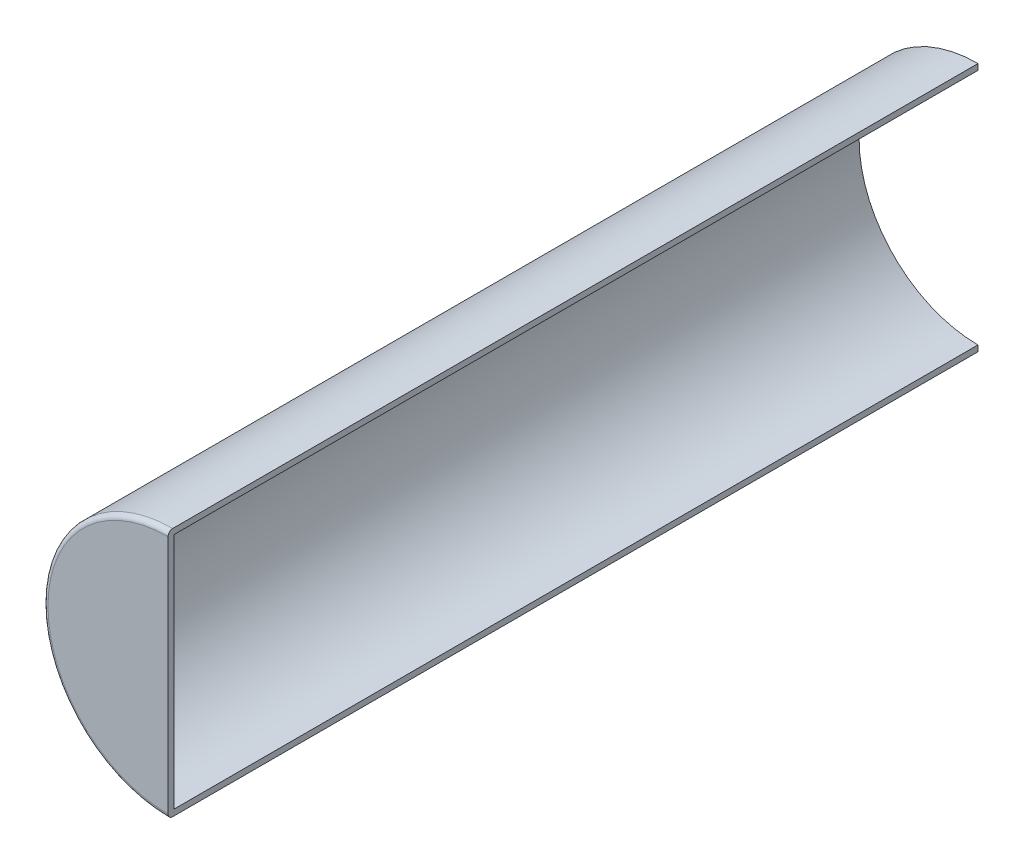
ISO-10303-21;
HEADER;
FILE_DESCRIPTION(('STEP AP214'),'2;1');
FILE_NAME('part.step','',(''),(''),'','','');
FILE_SCHEMA(('AUTOMOTIVE_DESIGN { 1 0 10303 214 1 1 1 1 }'));
ENDSEC;
DATA;
#1=APPLICATION_CONTEXT('core data for automotive mechanical design processes');
#2=APPLICATION_PROTOCOL_DEFINITION('international standard','automotive_design',2000,#1);
#3=PRODUCT_CONTEXT('',#1,'mechanical');
#4=PRODUCT('Part','Part','',(#3));
#5=PRODUCT_RELATED_PRODUCT_CATEGORY('part','',(#4));
#6=PRODUCT_DEFINITION_FORMATION('','',#4);
#7=PRODUCT_DEFINITION_CONTEXT('part definition',#1,'design');
#8=PRODUCT_DEFINITION('design','',#6,#7);
#9=PRODUCT_DEFINITION_SHAPE('','',#8);
#10=(LENGTH_UNIT() NAMED_UNIT(*) SI_UNIT(.MILLI.,.METRE.));
#11=(NAMED_UNIT(*) PLANE_ANGLE_UNIT() SI_UNIT($,.RADIAN.));
#12=(NAMED_UNIT(*) SI_UNIT($,.STERADIAN.) SOLID_ANGLE_UNIT());
#13=UNCERTAINTY_MEASURE_WITH_UNIT(LENGTH_MEASURE(1.E-05),#10,'distance_accuracy_value','');
#14=(GEOMETRIC_REPRESENTATION_CONTEXT(3) GLOBAL_UNCERTAINTY_ASSIGNED_CONTEXT((#13)) GLOBAL_UNIT_ASSIGNED_CONTEXT((#10,
#11,#12)) REPRESENTATION_CONTEXT('',''));
#15=CARTESIAN_POINT('',(0.,0.,0.));
#16=DIRECTION('',(0.,0.,1.));
#17=DIRECTION('',(1.,0.,0.));
#18=AXIS2_PLACEMENT_3D('',#15,#16,#17);
#19=CARTESIAN_POINT('',(8.59999999999998,0.,-68.27));
#20=DIRECTION('',(0.,0.,1.));
#21=DIRECTION('',(1.,0.,0.));
#22=AXIS2_PLACEMENT_3D('',#19,#20,#21);
#23=PLANE('',#22);
#24=CARTESIAN_POINT('',(0.,0.,-68.27));
#25=DIRECTION('',(0.,0.,1.));
#26=DIRECTION('',(1.,0.,0.));
#27=AXIS2_PLACEMENT_3D('',#24,#25,#26);
#28=CIRCLE('',#27,10.52);
#29=CARTESIAN_POINT('',(0.,-10.52,-68.27));
#30=VERTEX_POINT('',#29);
#31=CARTESIAN_POINT('',(0.,10.52,-68.27));
#32=VERTEX_POINT('',#31);
#33=EDGE_CURVE('E82',#30,#32,#28,.F.);
#34=ORIENTED_EDGE('',*,*,#33,.T.);
#35=DIRECTION('',(0.,-1.,0.));
#36=VECTOR('',#35,1.);
#37=CARTESIAN_POINT('',(0.,0.,-68.27));
#38=LINE('',#37,#36);
#39=CARTESIAN_POINT('',(0.,10.02,-68.27));
#40=VERTEX_POINT('',#39);
#41=EDGE_CURVE('E87',#32,#40,#38,.T.);
#42=ORIENTED_EDGE('',*,*,#41,.T.);
#43=CARTESIAN_POINT('',(0.,0.,-68.27));
#44=DIRECTION('',(0.,0.,1.));
#45=DIRECTION('',(1.,0.,0.));
#46=AXIS2_PLACEMENT_3D('',#43,#44,#45);
#47=CIRCLE('',#46,10.02);
#48=CARTESIAN_POINT('',(0.,-10.02,-68.27));
#49=VERTEX_POINT('',#48);
#50=EDGE_CURVE('E93',#49,#40,#47,.F.);
#51=ORIENTED_EDGE('',*,*,#50,.F.);
#52=EDGE_CURVE('E54',#49,#30,#38,.T.);
#53=ORIENTED_EDGE('',*,*,#52,.T.);
#54=EDGE_LOOP('',(#34,#42,#51,#53));
#55=FACE_BOUND('',#54,.T.);
#56=ADVANCED_FACE('F33',(#55),#23,.F.);
#57=CARTESIAN_POINT('',(10.12,0.,-0.5));
#58=DIRECTION('',(0.,0.,1.));
#59=DIRECTION('',(1.,0.,0.));
#60=AXIS2_PLACEMENT_3D('',#57,#58,#59);
#61=PLANE('',#60);
#62=CARTESIAN_POINT('',(0.,0.,-0.5));
#63=DIRECTION('',(0.,0.,1.));
#64=DIRECTION('',(1.,0.,0.));
#65=AXIS2_PLACEMENT_3D('',#62,#63,#64);
#66=CIRCLE('',#65,10.02);
#67=CARTESIAN_POINT('',(0.,10.02,-0.5));
#68=VERTEX_POINT('',#67);
#69=CARTESIAN_POINT('',(0.,-10.02,-0.5));
#70=VERTEX_POINT('',#69);
#71=EDGE_CURVE('E91',#68,#70,#66,.T.);
#72=ORIENTED_EDGE('',*,*,#71,.F.);
#73=DIRECTION('',(0.,-1.,0.));
#74=VECTOR('',#73,1.);
#75=CARTESIAN_POINT('',(0.,0.,-0.5));
#76=LINE('',#75,#74);
#77=EDGE_CURVE('E118',#68,#70,#76,.T.);
#78=ORIENTED_EDGE('',*,*,#77,.T.);
#79=EDGE_LOOP('',(#72,#78));
#80=FACE_BOUND('',#79,.T.);
#81=ADVANCED_FACE('F124',(#80),#61,.F.);
#82=CARTESIAN_POINT('',(0.,0.,0.));
#83=DIRECTION('',(0.,0.,1.));
#84=DIRECTION('',(1.,0.,0.));
#85=AXIS2_PLACEMENT_3D('',#82,#83,#84);
#86=CYLINDRICAL_SURFACE('',#85,10.02);
#87=ORIENTED_EDGE('',*,*,#71,.T.);
#88=DIRECTION('',(0.,0.,1.));
#89=VECTOR('',#88,1.);
#90=CARTESIAN_POINT('',(0.,-10.02,0.));
#91=LINE('',#90,#89);
#92=EDGE_CURVE('E96',#70,#49,#91,.F.);
#93=ORIENTED_EDGE('',*,*,#92,.T.);
#94=ORIENTED_EDGE('',*,*,#50,.T.);
#95=DIRECTION('',(0.,0.,1.));
#96=VECTOR('',#95,1.);
#97=CARTESIAN_POINT('',(0.,10.02,0.));
#98=LINE('',#97,#96);
#99=EDGE_CURVE('E115',#40,#68,#98,.T.);
#100=ORIENTED_EDGE('',*,*,#99,.T.);
#101=EDGE_LOOP('',(#87,#93,#94,#100));
#102=FACE_BOUND('',#101,.T.);
#103=ADVANCED_FACE('F121',(#102),#86,.F.);
#104=CARTESIAN_POINT('',(10.12,0.,0.));
#105=DIRECTION('',(0.,0.,1.));
#106=DIRECTION('',(1.,0.,0.));
#107=AXIS2_PLACEMENT_3D('',#104,#105,#106);
#108=PLANE('',#107);
#109=DIRECTION('',(0.,-1.,0.));
#110=VECTOR('',#109,1.);
#111=CARTESIAN_POINT('',(0.,0.,0.));
#112=LINE('',#111,#110);
#113=CARTESIAN_POINT('',(0.,10.12,0.));
#114=VERTEX_POINT('',#113);
#115=CARTESIAN_POINT('',(0.,-10.12,0.));
#116=VERTEX_POINT('',#115);
#117=EDGE_CURVE('E76',#114,#116,#112,.T.);
#118=ORIENTED_EDGE('',*,*,#117,.F.);
#119=CARTESIAN_POINT('',(0.,0.,0.));
#120=DIRECTION('',(0.,0.,1.));
#121=DIRECTION('',(1.,0.,0.));
#122=AXIS2_PLACEMENT_3D('',#119,#120,#121);
#123=CIRCLE('',#122,10.12);
#124=EDGE_CURVE('E86',#114,#116,#123,.T.);
#125=ORIENTED_EDGE('',*,*,#124,.T.);
#126=EDGE_LOOP('',(#118,#125));
#127=FACE_BOUND('',#126,.T.);
#128=ADVANCED_FACE('F85',(#127),#108,.T.);
#129=CARTESIAN_POINT('',(0.,0.,0.));
#130=DIRECTION('',(0.,0.,1.));
#131=DIRECTION('',(1.,0.,0.));
#132=AXIS2_PLACEMENT_3D('',#129,#130,#131);
#133=CYLINDRICAL_SURFACE('',#132,10.52);
#134=DIRECTION('',(0.,0.,1.));
#135=VECTOR('',#134,1.);
#136=CARTESIAN_POINT('',(0.,-10.52,0.));
#137=LINE('',#136,#135);
#138=CARTESIAN_POINT('',(0.,-10.52,-0.400000000000003));
#139=VERTEX_POINT('',#138);
#140=EDGE_CURVE('E110',#139,#30,#137,.F.);
#141=ORIENTED_EDGE('',*,*,#140,.F.);
#142=CARTESIAN_POINT('',(0.,0.,-0.400000000000003));
#143=DIRECTION('',(0.,0.,1.));
#144=DIRECTION('',(1.,0.,0.));
#145=AXIS2_PLACEMENT_3D('',#142,#143,#144);
#146=CIRCLE('',#145,10.52);
#147=CARTESIAN_POINT('',(0.,10.52,-0.400000000000003));
#148=VERTEX_POINT('',#147);
#149=EDGE_CURVE('E90',#148,#139,#146,.T.);
#150=ORIENTED_EDGE('',*,*,#149,.F.);
#151=DIRECTION('',(0.,0.,1.));
#152=VECTOR('',#151,1.);
#153=CARTESIAN_POINT('',(0.,10.52,0.));
#154=LINE('',#153,#152);
#155=EDGE_CURVE('E47',#32,#148,#154,.T.);
#156=ORIENTED_EDGE('',*,*,#155,.F.);
#157=ORIENTED_EDGE('',*,*,#33,.F.);
#158=EDGE_LOOP('',(#141,#150,#156,#157));
#159=FACE_BOUND('',#158,.T.);
#160=ADVANCED_FACE('F109',(#159),#133,.T.);
#161=CARTESIAN_POINT('',(0.,0.,-0.4));
#162=DIRECTION('',(0.,0.,1.));
#163=DIRECTION('',(1.,0.,0.));
#164=AXIS2_PLACEMENT_3D('',#161,#162,#163);
#165=TOROIDAL_SURFACE('',#164,10.12,0.4);
#166=CARTESIAN_POINT('',(0.,-10.12,-0.4));
#167=DIRECTION('',(-1.,0.,0.));
#168=DIRECTION('',(0.,0.,1.));
#169=AXIS2_PLACEMENT_3D('',#166,#167,#168);
#170=CIRCLE('',#169,0.4);
#171=EDGE_CURVE('E11',#116,#139,#170,.F.);
#172=ORIENTED_EDGE('',*,*,#171,.F.);
#173=ORIENTED_EDGE('',*,*,#124,.F.);
#174=CARTESIAN_POINT('',(0.,10.12,-0.4));
#175=DIRECTION('',(-1.,0.,0.));
#176=DIRECTION('',(0.,0.,1.));
#177=AXIS2_PLACEMENT_3D('',#174,#175,#176);
#178=CIRCLE('',#177,0.4);
#179=EDGE_CURVE('E40',#148,#114,#178,.F.);
#180=ORIENTED_EDGE('',*,*,#179,.F.);
#181=ORIENTED_EDGE('',*,*,#149,.T.);
#182=EDGE_LOOP('',(#172,#173,#180,#181));
#183=FACE_BOUND('',#182,.T.);
#184=ADVANCED_FACE('F89',(#183),#165,.T.);
#185=CARTESIAN_POINT('',(0.,0.,0.));
#186=DIRECTION('',(-1.,0.,0.));
#187=DIRECTION('',(0.,0.,1.));
#188=AXIS2_PLACEMENT_3D('',#185,#186,#187);
#189=PLANE('',#188);
#190=ORIENTED_EDGE('',*,*,#77,.F.);
#191=ORIENTED_EDGE('',*,*,#99,.F.);
#192=ORIENTED_EDGE('',*,*,#41,.F.);
#193=ORIENTED_EDGE('',*,*,#155,.T.);
#194=ORIENTED_EDGE('',*,*,#179,.T.);
#195=ORIENTED_EDGE('',*,*,#117,.T.);
#196=ORIENTED_EDGE('',*,*,#171,.T.);
#197=ORIENTED_EDGE('',*,*,#140,.T.);
#198=ORIENTED_EDGE('',*,*,#52,.F.);
#199=ORIENTED_EDGE('',*,*,#92,.F.);
#200=EDGE_LOOP('',(#190,#191,#192,#193,#194,#195,#196,#197,#198,#199));
#201=FACE_BOUND('',#200,.T.);
#202=ADVANCED_FACE('F75',(#201),#189,.F.);
#203=CLOSED_SHELL('',(#56,#81,#103,#128,#160,#184,#202));
#204=MANIFOLD_SOLID_BREP('B2',#203);
#205=ADVANCED_BREP_SHAPE_REPRESENTATION('',(#18,#204),#14);
#206=SHAPE_DEFINITION_REPRESENTATION(#9,#205);
ENDSEC;
END-ISO-10303-21;
